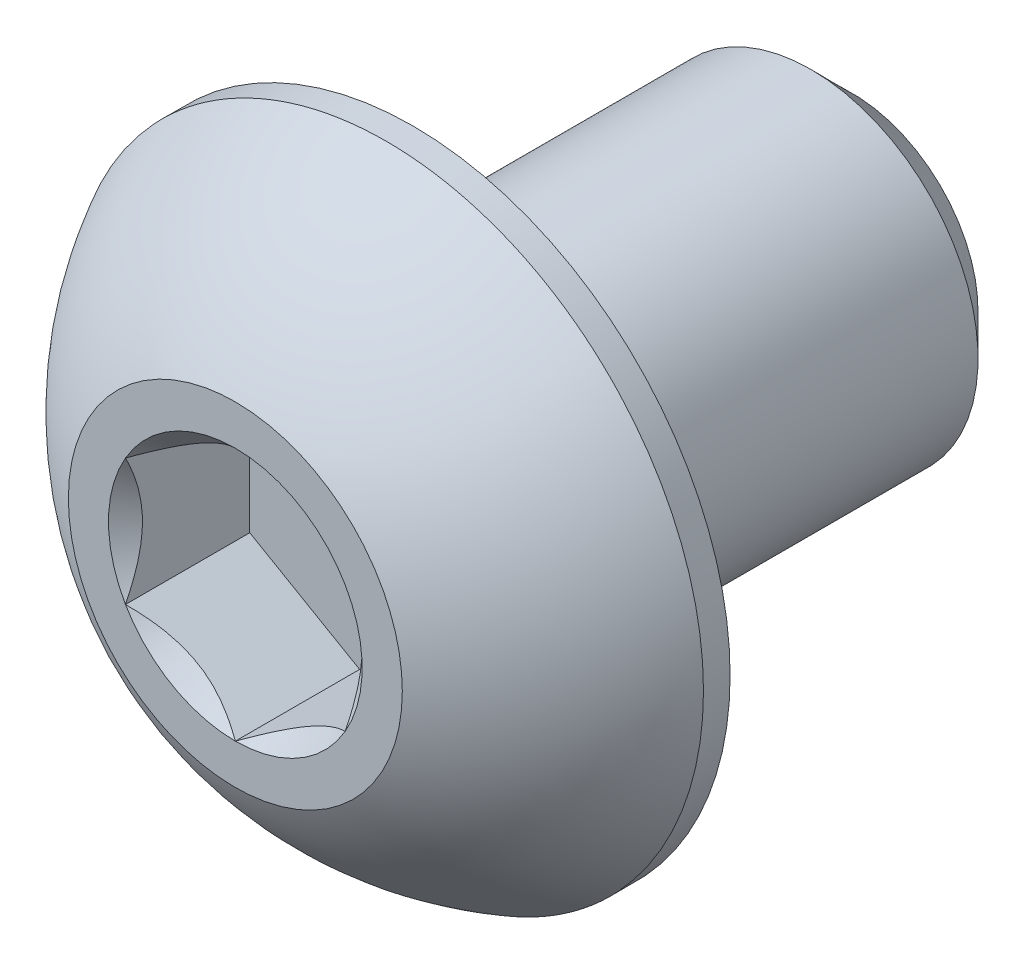
ISO-10303-21;
HEADER;
FILE_DESCRIPTION(('STEP AP214'),'2;1');
FILE_NAME('part.step','',(''),(''),'','','');
FILE_SCHEMA(('AUTOMOTIVE_DESIGN { 1 0 10303 214 1 1 1 1 }'));
ENDSEC;
DATA;
#1=APPLICATION_CONTEXT('core data for automotive mechanical design processes');
#2=APPLICATION_PROTOCOL_DEFINITION('international standard','automotive_design',2000,#1);
#3=PRODUCT_CONTEXT('',#1,'mechanical');
#4=PRODUCT('Part','Part','',(#3));
#5=PRODUCT_RELATED_PRODUCT_CATEGORY('part','',(#4));
#6=PRODUCT_DEFINITION_FORMATION('','',#4);
#7=PRODUCT_DEFINITION_CONTEXT('part definition',#1,'design');
#8=PRODUCT_DEFINITION('design','',#6,#7);
#9=PRODUCT_DEFINITION_SHAPE('','',#8);
#10=(LENGTH_UNIT() NAMED_UNIT(*) SI_UNIT(.MILLI.,.METRE.));
#11=(NAMED_UNIT(*) PLANE_ANGLE_UNIT() SI_UNIT($,.RADIAN.));
#12=(NAMED_UNIT(*) SI_UNIT($,.STERADIAN.) SOLID_ANGLE_UNIT());
#13=UNCERTAINTY_MEASURE_WITH_UNIT(LENGTH_MEASURE(1.E-05),#10,'distance_accuracy_value','');
#14=(GEOMETRIC_REPRESENTATION_CONTEXT(3) GLOBAL_UNCERTAINTY_ASSIGNED_CONTEXT((#13)) GLOBAL_UNIT_ASSIGNED_CONTEXT((#10,
#11,#12)) REPRESENTATION_CONTEXT('',''));
#15=CARTESIAN_POINT('',(0.,0.,0.));
#16=DIRECTION('',(0.,0.,1.));
#17=DIRECTION('',(1.,0.,0.));
#18=AXIS2_PLACEMENT_3D('',#15,#16,#17);
#19=CARTESIAN_POINT('',(1.5875,-0.91654355233853,-1.79578));
#20=DIRECTION('',(1.,0.,0.));
#21=DIRECTION('',(0.,0.,-1.));
#22=AXIS2_PLACEMENT_3D('',#19,#20,#21);
#23=PLANE('',#22);
#24=CARTESIAN_POINT('',(1.5875,0.916543552350696,-4.5148160186422E-11));
#25=CARTESIAN_POINT('',(1.5875,0.853951042749501,-0.0312670531094748));
#26=CARTESIAN_POINT('',(1.5875,0.790318655182352,-0.060708418532569));
#27=CARTESIAN_POINT('',(1.5875,0.660541633657406,-0.114675036009976));
#28=CARTESIAN_POINT('',(1.5875,0.594383506068261,-0.139167551527056));
#29=CARTESIAN_POINT('',(1.5875,0.460155167710008,-0.181460861757154));
#30=CARTESIAN_POINT('',(1.5875,0.392092287368855,-0.199284303379211));
#31=CARTESIAN_POINT('',(1.5875,0.254474472998349,-0.226724262258425));
#32=CARTESIAN_POINT('',(1.5875,0.18492484408494,-0.23636615820705));
#33=CARTESIAN_POINT('',(1.5875,0.0959348173027099,-0.242807117936028));
#34=CARTESIAN_POINT('',(1.5875,0.0767574755188689,-0.243848419588411));
#35=CARTESIAN_POINT('',(1.5875,0.0383876515905481,-0.245238539012701));
#36=CARTESIAN_POINT('',(1.5875,0.0191951833459475,-0.245587732962164));
#37=CARTESIAN_POINT('',(1.5875,-0.04817613738867,-0.245585527984756));
#38=CARTESIAN_POINT('',(1.5875,-0.0963693775085044,-0.243380381653055));
#39=CARTESIAN_POINT('',(1.5875,-0.19237997675968,-0.234690759054081));
#40=CARTESIAN_POINT('',(1.5875,-0.240197050167174,-0.22820329805671));
#41=CARTESIAN_POINT('',(1.5875,-0.383011002180377,-0.202723016482505));
#42=CARTESIAN_POINT('',(1.5875,-0.476967063071653,-0.177716619167796));
#43=CARTESIAN_POINT('',(1.5875,-0.628737189875188,-0.12655997132136));
#44=CARTESIAN_POINT('',(1.5875,-0.687787687831008,-0.103812337902688));
#45=CARTESIAN_POINT('',(1.5875,-0.803652764120619,-0.0545108768258671));
#46=CARTESIAN_POINT('',(1.5875,-0.860482853236759,-0.0279937656188529));
#47=CARTESIAN_POINT('',(1.5875,-0.916543552350696,-4.51483398026577E-11));
#48=B_SPLINE_CURVE_WITH_KNOTS('',3,(#24,#25,#26,#27,#28,#29,#30,#31,#32,#33,#34,#35,#36,#37,#38,
#39,#40,#41,#42,#43,#44,#45,#46,#47),.UNSPECIFIED.,.F.,.F.,(4,2,2,2,2,2,2,2,2,2,2,4),(0.,
0.210047204138572,0.421441388615704,0.632111059443719,0.842124830787818,0.89973295340684,
0.957309755998791,1.10181621379492,1.246423497634,1.53683268063418,1.72655304070107,
1.91453812064177),.UNSPECIFIED.);
#49=CARTESIAN_POINT('',(1.58750000000527,0.916543552341572,-4.51482158423473E-11));
#50=VERTEX_POINT('',#49);
#51=CARTESIAN_POINT('',(1.58750000000527,-0.916543552341572,-4.51486722899349E-11));
#52=VERTEX_POINT('',#51);
#53=EDGE_CURVE('E20',#50,#52,#48,.T.);
#54=ORIENTED_EDGE('',*,*,#53,.F.);
#55=DIRECTION('',(0.,0.,1.));
#56=VECTOR('',#55,1.);
#57=CARTESIAN_POINT('',(1.5875,0.916543552338531,-1.79578));
#58=LINE('',#57,#56);
#59=CARTESIAN_POINT('',(1.5875,0.916543552338531,-1.79578));
#60=VERTEX_POINT('',#59);
#61=EDGE_CURVE('E77',#50,#60,#58,.F.);
#62=ORIENTED_EDGE('',*,*,#61,.T.);
#63=DIRECTION('',(0.,1.,0.));
#64=VECTOR('',#63,1.);
#65=CARTESIAN_POINT('',(1.5875,-0.91654355233853,-1.79578));
#66=LINE('',#65,#64);
#67=CARTESIAN_POINT('',(1.5875,-0.91654355233853,-1.79578));
#68=VERTEX_POINT('',#67);
#69=EDGE_CURVE('E83',#68,#60,#66,.T.);
#70=ORIENTED_EDGE('',*,*,#69,.F.);
#71=DIRECTION('',(0.,0.,1.));
#72=VECTOR('',#71,1.);
#73=CARTESIAN_POINT('',(1.5875,-0.91654355233853,-1.79578));
#74=LINE('',#73,#72);
#75=EDGE_CURVE('E79',#68,#52,#74,.T.);
#76=ORIENTED_EDGE('',*,*,#75,.T.);
#77=EDGE_LOOP('',(#54,#62,#70,#76));
#78=FACE_BOUND('',#77,.T.);
#79=ADVANCED_FACE('F16',(#78),#23,.F.);
#80=CARTESIAN_POINT('',(1.5875,-0.91654355233853,-1.79578));
#81=DIRECTION('',(0.,0.,1.));
#82=DIRECTION('',(1.,0.,0.));
#83=AXIS2_PLACEMENT_3D('',#80,#81,#82);
#84=PLANE('',#83);
#85=DIRECTION('',(0.,-1.,0.));
#86=VECTOR('',#85,1.);
#87=CARTESIAN_POINT('',(-1.5875,0.916543552338531,-1.79578));
#88=LINE('',#87,#86);
#89=CARTESIAN_POINT('',(-1.5875,0.91654355233853,-1.79578));
#90=VERTEX_POINT('',#89);
#91=CARTESIAN_POINT('',(-1.5875,-0.916543552338531,-1.79578));
#92=VERTEX_POINT('',#91);
#93=EDGE_CURVE('E247',#90,#92,#88,.T.);
#94=ORIENTED_EDGE('',*,*,#93,.T.);
#95=DIRECTION('',(0.866025403784439,-0.5,0.));
#96=VECTOR('',#95,1.);
#97=CARTESIAN_POINT('',(-1.5875,-0.916543552338531,-1.79578));
#98=LINE('',#97,#96);
#99=CARTESIAN_POINT('',(0.,-1.83308710467706,-1.79578));
#100=VERTEX_POINT('',#99);
#101=EDGE_CURVE('E278',#92,#100,#98,.T.);
#102=ORIENTED_EDGE('',*,*,#101,.T.);
#103=DIRECTION('',(0.866025403784438,0.5,0.));
#104=VECTOR('',#103,1.);
#105=CARTESIAN_POINT('',(0.,-1.83308710467706,-1.79578));
#106=LINE('',#105,#104);
#107=EDGE_CURVE('E265',#100,#68,#106,.T.);
#108=ORIENTED_EDGE('',*,*,#107,.T.);
#109=ORIENTED_EDGE('',*,*,#69,.T.);
#110=DIRECTION('',(-0.866025403784439,0.5,0.));
#111=VECTOR('',#110,1.);
#112=CARTESIAN_POINT('',(1.5875,0.916543552338531,-1.79578));
#113=LINE('',#112,#111);
#114=CARTESIAN_POINT('',(0.,1.83308710467706,-1.79578));
#115=VERTEX_POINT('',#114);
#116=EDGE_CURVE('E93',#60,#115,#113,.T.);
#117=ORIENTED_EDGE('',*,*,#116,.T.);
#118=DIRECTION('',(-0.866025403784438,-0.5,0.));
#119=VECTOR('',#118,1.);
#120=CARTESIAN_POINT('',(0.,1.83308710467706,-1.79578));
#121=LINE('',#120,#119);
#122=EDGE_CURVE('E95',#115,#90,#121,.T.);
#123=ORIENTED_EDGE('',*,*,#122,.T.);
#124=EDGE_LOOP('',(#94,#102,#108,#109,#117,#123));
#125=FACE_BOUND('',#124,.T.);
#126=ADVANCED_FACE('F184',(#125),#84,.T.);
#127=CARTESIAN_POINT('',(-1.5875,-0.916543552338531,-1.79578));
#128=DIRECTION('',(-0.5,-0.866025403784439,0.));
#129=DIRECTION('',(0.866025403784439,-0.5,0.));
#130=AXIS2_PLACEMENT_3D('',#127,#128,#129);
#131=PLANE('',#130);
#132=CARTESIAN_POINT('',(-1.58750000000813,-0.916543552333836,-4.65365177804234E-11));
#133=CARTESIAN_POINT('',(-1.53293684973442,-0.948045601832198,-0.0314718176892667));
#134=CARTESIAN_POINT('',(-1.47746140241271,-0.980074366276803,-0.0610949372672066));
#135=CARTESIAN_POINT('',(-1.36434127230903,-1.04538430384293,-0.115333604591992));
#136=CARTESIAN_POINT('',(-1.30668583767504,-1.07867168454911,-0.139918983823398));
#137=CARTESIAN_POINT('',(-1.1904264819008,-1.14579405490118,-0.18203390392943));
#138=CARTESIAN_POINT('',(-1.13185215255292,-1.17961195971778,-0.199669270496182));
#139=CARTESIAN_POINT('',(-1.01341433779326,-1.2479920639515,-0.226839911359059));
#140=CARTESIAN_POINT('',(-0.95355446788638,-1.28255217595589,-0.236395459908957));
#141=CARTESIAN_POINT('',(-0.850383225835588,-1.34211812032654,-0.245017258142065));
#142=CARTESIAN_POINT('',(-0.807205047661772,-1.36704705311831,-0.24629317825213));
#143=CARTESIAN_POINT('',(-0.720919334101995,-1.41686413306927,-0.244140862172588));
#144=CARTESIAN_POINT('',(-0.677811828778317,-1.44175226287199,-0.240710977134276));
#145=CARTESIAN_POINT('',(-0.592014799905288,-1.4912872005875,-0.22934368581992));
#146=CARTESIAN_POINT('',(-0.54932567052745,-1.51593378092527,-0.2214023797855));
#147=CARTESIAN_POINT('',(-0.464663949078726,-1.56481324859374,-0.2014437231592));
#148=CARTESIAN_POINT('',(-0.422691672575671,-1.58904595373128,-0.189424623694276));
#149=CARTESIAN_POINT('',(-0.315224720340997,-1.65109202753296,-0.153756168099754));
#150=CARTESIAN_POINT('',(-0.25039544383198,-1.68852122777681,-0.127422292452885));
#151=CARTESIAN_POINT('',(-0.155071115632602,-1.74355675432304,-0.0829693854516809));
#152=CARTESIAN_POINT('',(-0.12365879001164,-1.76169266897618,-0.0673516407383855));
#153=CARTESIAN_POINT('',(-0.0614115175424615,-1.79763114849258,-0.0346905494690997));
#154=CARTESIAN_POINT('',(-0.0305763044110986,-1.81543386709449,-0.0176478812714443));
#155=CARTESIAN_POINT('',(8.13171000505997E-12,-1.83308710468176,-4.65365727835881E-11));
#156=B_SPLINE_CURVE_WITH_KNOTS('',3,(#132,#133,#134,#135,#136,#137,#138,#139,#140,#141,#142,
#143,#144,#145,#146,#147,#148,#149,#150,#151,#152,#153,#154,#155),.UNSPECIFIED.,.F.,.F.,(4,2,2,
2,2,2,2,2,2,2,2,4),(0.,0.211427927731364,0.424087197146833,0.633370156420732,0.842126401513702,
0.991537201097076,1.14100036551936,1.29059292577182,1.44024972414901,1.67781721416321,
1.79627069410093,1.91466809994021),.UNSPECIFIED.);
#157=CARTESIAN_POINT('',(-1.5875,-0.916543552337613,-5.16900107800149E-11));
#158=VERTEX_POINT('',#157);
#159=CARTESIAN_POINT('',(4.06570704929158E-12,-1.8330871046766,-5.16899866893727E-11));
#160=VERTEX_POINT('',#159);
#161=EDGE_CURVE('E186',#158,#160,#156,.T.);
#162=ORIENTED_EDGE('',*,*,#161,.T.);
#163=DIRECTION('',(0.,0.,1.));
#164=VECTOR('',#163,1.);
#165=CARTESIAN_POINT('',(0.,-1.83308710467706,-1.79578));
#166=LINE('',#165,#164);
#167=EDGE_CURVE('E257',#160,#100,#166,.F.);
#168=ORIENTED_EDGE('',*,*,#167,.T.);
#169=ORIENTED_EDGE('',*,*,#101,.F.);
#170=DIRECTION('',(0.,0.,1.));
#171=VECTOR('',#170,1.);
#172=CARTESIAN_POINT('',(-1.5875,-0.916543552338531,-1.79578));
#173=LINE('',#172,#171);
#174=EDGE_CURVE('E241',#92,#158,#173,.T.);
#175=ORIENTED_EDGE('',*,*,#174,.T.);
#176=EDGE_LOOP('',(#162,#168,#169,#175));
#177=FACE_BOUND('',#176,.T.);
#178=ADVANCED_FACE('F180',(#177),#131,.F.);
#179=CARTESIAN_POINT('',(0.,-1.83308710467706,-1.79578));
#180=DIRECTION('',(0.5,-0.866025403784438,0.));
#181=DIRECTION('',(0.866025403784438,0.5,0.));
#182=AXIS2_PLACEMENT_3D('',#179,#180,#181);
#183=PLANE('',#182);
#184=CARTESIAN_POINT('',(-8.13084748350422E-12,-1.83308710468176,-4.65361675164433E-11));
#185=CARTESIAN_POINT('',(0.0545631502655831,-1.80158505518339,-0.0314718176892672));
#186=CARTESIAN_POINT('',(0.110038597587296,-1.76955629073879,-0.0610949372672078));
#187=CARTESIAN_POINT('',(0.22315872769098,-1.70424635317266,-0.115333604591995));
#188=CARTESIAN_POINT('',(0.280814162324968,-1.67095897246648,-0.1399189838234));
#189=CARTESIAN_POINT('',(0.397073518099212,-1.60383660211441,-0.182033903929432));
#190=CARTESIAN_POINT('',(0.455647847447088,-1.57001869729781,-0.199669270496184));
#191=CARTESIAN_POINT('',(0.574085662206744,-1.50163859306409,-0.226839911359059));
#192=CARTESIAN_POINT('',(0.633945532113621,-1.4670784810597,-0.236395459908957));
#193=CARTESIAN_POINT('',(0.737116774164411,-1.40751253668905,-0.245017258142065));
#194=CARTESIAN_POINT('',(0.780294952338226,-1.38258360389728,-0.24629317825213));
#195=CARTESIAN_POINT('',(0.866580665898003,-1.33276652394632,-0.244140862172588));
#196=CARTESIAN_POINT('',(0.90968817122168,-1.30787839414361,-0.240710977134277));
#197=CARTESIAN_POINT('',(0.995485200094709,-1.25834345642809,-0.229343685819921));
#198=CARTESIAN_POINT('',(1.03817432947255,-1.23369687609033,-0.2214023797855));
#199=CARTESIAN_POINT('',(1.12283605092127,-1.18481740842185,-0.2014437231592));
#200=CARTESIAN_POINT('',(1.16480832742433,-1.16058470328431,-0.189424623694276));
#201=CARTESIAN_POINT('',(1.27227527965931,-1.09853862948245,-0.153756168099651));
#202=CARTESIAN_POINT('',(1.33710455616863,-1.06110942923843,-0.127422292452638));
#203=CARTESIAN_POINT('',(1.43242888436844,-1.00607390269195,-0.0829693854511779));
#204=CARTESIAN_POINT('',(1.46384120998954,-0.987937988038733,-0.0673516407377908));
#205=CARTESIAN_POINT('',(1.52608848245899,-0.951999508522174,-0.0346905494683118));
#206=CARTESIAN_POINT('',(1.55692369559049,-0.934196789920184,-0.0176478812705549));
#207=CARTESIAN_POINT('',(1.58750000000985,-0.916543552332841,-4.55419445064032E-11));
#208=B_SPLINE_CURVE_WITH_KNOTS('',3,(#184,#185,#186,#187,#188,#189,#190,#191,#192,#193,#194,
#195,#196,#197,#198,#199,#200,#201,#202,#203,#204,#205,#206,#207),.UNSPECIFIED.,.F.,.F.,(4,2,2,
2,2,2,2,2,2,2,2,4),(0.,0.211427927731369,0.424087197146844,0.633370156420738,0.842126401513702,
0.991537201097074,1.14100036551936,1.29059292577182,1.44024972414901,1.67781721416432,
1.7962706941026,1.91466809994243),.UNSPECIFIED.);
#209=EDGE_CURVE('E103',#160,#52,#208,.T.);
#210=ORIENTED_EDGE('',*,*,#209,.T.);
#211=ORIENTED_EDGE('',*,*,#75,.F.);
#212=ORIENTED_EDGE('',*,*,#107,.F.);
#213=ORIENTED_EDGE('',*,*,#167,.F.);
#214=EDGE_LOOP('',(#210,#211,#212,#213));
#215=FACE_BOUND('',#214,.T.);
#216=ADVANCED_FACE('F175',(#215),#183,.F.);
#217=CARTESIAN_POINT('',(1.5875,0.916543552338531,-1.79578));
#218=DIRECTION('',(0.5,0.866025403784439,0.));
#219=DIRECTION('',(-0.866025403784439,0.5,0.));
#220=AXIS2_PLACEMENT_3D('',#217,#218,#219);
#221=PLANE('',#220);
#222=CARTESIAN_POINT('',(1.58750000000388,0.916543552325157,-4.09205335444077E-11));
#223=CARTESIAN_POINT('',(1.53293684973449,0.948045601828149,-0.0314718176863875));
#224=CARTESIAN_POINT('',(1.47746140241465,0.980074366274606,-0.0610949372654595));
#225=CARTESIAN_POINT('',(1.3643412723126,1.04538430384195,-0.1153336045911));
#226=CARTESIAN_POINT('',(1.30668583767836,1.07867168454748,-0.139918983822225));
#227=CARTESIAN_POINT('',(1.19042648190426,1.1457940548989,-0.182033903928146));
#228=CARTESIAN_POINT('',(1.13185215255677,1.17961195971548,-0.199669270495064));
#229=CARTESIAN_POINT('',(1.01341433779771,1.247992063949,-0.226839911358272));
#230=CARTESIAN_POINT('',(0.953554467891033,1.28255217595322,-0.236395459908332));
#231=CARTESIAN_POINT('',(0.85038322584057,1.34211812032365,-0.245017258141818));
#232=CARTESIAN_POINT('',(0.807205047666872,1.36704705311536,-0.246293178252067));
#233=CARTESIAN_POINT('',(0.720919334107315,1.4168641330662,-0.24414086217291));
#234=CARTESIAN_POINT('',(0.677811828783741,1.44175226286886,-0.240710977134801));
#235=CARTESIAN_POINT('',(0.592014799910885,1.49128720058427,-0.229343685820857));
#236=CARTESIAN_POINT('',(0.549325670533118,1.51593378092199,-0.221402379786645));
#237=CARTESIAN_POINT('',(0.464663949084521,1.5648132485904,-0.201443723160757));
#238=CARTESIAN_POINT('',(0.422691672581523,1.58904595372791,-0.189424623696037));
#239=CARTESIAN_POINT('',(0.315224720345838,1.65109202753017,-0.153756168101648));
#240=CARTESIAN_POINT('',(0.250395443835785,1.68852122777462,-0.127422292454545));
#241=CARTESIAN_POINT('',(0.155071115634923,1.7435567543217,-0.0829693854528209));
#242=CARTESIAN_POINT('',(0.123658790013484,1.76169266897511,-0.0673516407393276));
#243=CARTESIAN_POINT('',(0.0614115175433705,1.79763114849205,-0.0346905494696016));
#244=CARTESIAN_POINT('',(0.0305763044115495,1.81543386709423,-0.0176478812717039));
#245=CARTESIAN_POINT('',(-8.13179444088293E-12,1.83308710468176,-4.65362862267458E-11));
#246=B_SPLINE_CURVE_WITH_KNOTS('',3,(#222,#223,#224,#225,#226,#227,#228,#229,#230,#231,#232,
#233,#234,#235,#236,#237,#238,#239,#240,#241,#242,#243,#244,#245),.UNSPECIFIED.,.F.,.F.,(4,2,2,
2,2,2,2,2,2,2,2,4),(0.,0.211427927730897,0.424087197145704,0.633370156418781,0.842126401511014,
0.991537201094014,1.1410003655159,1.29059292576802,1.44024972414487,1.67781721416266,
1.79627069410213,1.91466809994315),.UNSPECIFIED.);
#247=CARTESIAN_POINT('',(-4.06599721055526E-12,1.8330871046766,-5.16897760556717E-11));
#248=VERTEX_POINT('',#247);
#249=EDGE_CURVE('E90',#50,#248,#246,.T.);
#250=ORIENTED_EDGE('',*,*,#249,.T.);
#251=DIRECTION('',(0.,0.,1.));
#252=VECTOR('',#251,1.);
#253=CARTESIAN_POINT('',(0.,1.83308710467706,-1.79578));
#254=LINE('',#253,#252);
#255=EDGE_CURVE('E250',#248,#115,#254,.F.);
#256=ORIENTED_EDGE('',*,*,#255,.T.);
#257=ORIENTED_EDGE('',*,*,#116,.F.);
#258=ORIENTED_EDGE('',*,*,#61,.F.);
#259=EDGE_LOOP('',(#250,#256,#257,#258));
#260=FACE_BOUND('',#259,.T.);
#261=ADVANCED_FACE('F88',(#260),#221,.F.);
#262=CARTESIAN_POINT('',(0.,1.83308710467706,-1.79578));
#263=DIRECTION('',(-0.5,0.866025403784438,0.));
#264=DIRECTION('',(-0.866025403784438,-0.5,0.));
#265=AXIS2_PLACEMENT_3D('',#262,#263,#264);
#266=PLANE('',#265);
#267=CARTESIAN_POINT('',(8.13097600560689E-12,1.83308710468176,-4.65363184454702E-11));
#268=CARTESIAN_POINT('',(-0.0545631502655817,1.80158505518339,-0.0314718176892664));
#269=CARTESIAN_POINT('',(-0.110038597587293,1.76955629073879,-0.0610949372672064));
#270=CARTESIAN_POINT('',(-0.223158727690974,1.70424635317266,-0.115333604591992));
#271=CARTESIAN_POINT('',(-0.280814162324961,1.67095897246649,-0.139918983823398));
#272=CARTESIAN_POINT('',(-0.397073518099204,1.60383660211441,-0.18203390392943));
#273=CARTESIAN_POINT('',(-0.455647847447081,1.57001869729782,-0.199669270496182));
#274=CARTESIAN_POINT('',(-0.574085662206741,1.50163859306409,-0.226839911359059));
#275=CARTESIAN_POINT('',(-0.63394553211362,1.4670784810597,-0.236395459908958));
#276=CARTESIAN_POINT('',(-0.737116774164412,1.40751253668905,-0.245017258142065));
#277=CARTESIAN_POINT('',(-0.780294952338228,1.38258360389728,-0.24629317825213));
#278=CARTESIAN_POINT('',(-0.866580665898006,1.33276652394632,-0.244140862172588));
#279=CARTESIAN_POINT('',(-0.909688171221683,1.3078783941436,-0.240710977134277));
#280=CARTESIAN_POINT('',(-0.995485200094712,1.25834345642809,-0.22934368581992));
#281=CARTESIAN_POINT('',(-1.03817432947255,1.23369687609032,-0.2214023797855));
#282=CARTESIAN_POINT('',(-1.12283605092127,1.18481740842185,-0.2014437231592));
#283=CARTESIAN_POINT('',(-1.16480832742433,1.16058470328431,-0.189424623694275));
#284=CARTESIAN_POINT('',(-1.272275279659,1.09853862948263,-0.153756168099754));
#285=CARTESIAN_POINT('',(-1.33710455616802,1.06110942923878,-0.127422292452885));
#286=CARTESIAN_POINT('',(-1.4324288843674,1.00607390269255,-0.082969385451681));
#287=CARTESIAN_POINT('',(-1.46384120998836,0.987937988039414,-0.0673516407383855));
#288=CARTESIAN_POINT('',(-1.52608848245754,0.951999508523014,-0.0346905494690997));
#289=CARTESIAN_POINT('',(-1.5569236955889,0.934196789921102,-0.0176478812714444));
#290=CARTESIAN_POINT('',(-1.58750000000813,0.916543552333835,-4.653668523112E-11));
#291=B_SPLINE_CURVE_WITH_KNOTS('',3,(#267,#268,#269,#270,#271,#272,#273,#274,#275,#276,#277,
#278,#279,#280,#281,#282,#283,#284,#285,#286,#287,#288,#289,#290),.UNSPECIFIED.,.F.,.F.,(4,2,2,
2,2,2,2,2,2,2,2,4),(0.,0.211427927731364,0.424087197146833,0.633370156420733,0.842126401513703,
0.991537201097077,1.14100036551936,1.29059292577183,1.44024972414901,1.67781721416321,
1.79627069410093,1.91466809994021),.UNSPECIFIED.);
#292=CARTESIAN_POINT('',(-1.58750000000164,0.91654355233478,-5.16901581880083E-11));
#293=VERTEX_POINT('',#292);
#294=EDGE_CURVE('E102',#248,#293,#291,.T.);
#295=ORIENTED_EDGE('',*,*,#294,.T.);
#296=DIRECTION('',(0.,0.,1.));
#297=VECTOR('',#296,1.);
#298=CARTESIAN_POINT('',(-1.5875,0.916543552338531,-1.79578));
#299=LINE('',#298,#297);
#300=EDGE_CURVE('E44',#293,#90,#299,.F.);
#301=ORIENTED_EDGE('',*,*,#300,.T.);
#302=ORIENTED_EDGE('',*,*,#122,.F.);
#303=ORIENTED_EDGE('',*,*,#255,.F.);
#304=EDGE_LOOP('',(#295,#301,#302,#303));
#305=FACE_BOUND('',#304,.T.);
#306=ADVANCED_FACE('F174',(#305),#266,.F.);
#307=CARTESIAN_POINT('',(-1.5875,0.916543552338531,-1.79578));
#308=DIRECTION('',(-1.,0.,0.));
#309=DIRECTION('',(0.,-1.,0.));
#310=AXIS2_PLACEMENT_3D('',#307,#308,#309);
#311=PLANE('',#310);
#312=CARTESIAN_POINT('',(-1.5875,0.91654355234792,-4.65366352460325E-11));
#313=CARTESIAN_POINT('',(-1.5875,0.853539453351184,-0.0314718176892657));
#314=CARTESIAN_POINT('',(-1.5875,0.789481924461962,-0.0610949372672041));
#315=CARTESIAN_POINT('',(-1.5875,0.658862049329687,-0.115333604591986));
#316=CARTESIAN_POINT('',(-1.5875,0.59228728791732,-0.139918983823388));
#317=CARTESIAN_POINT('',(-1.5875,0.458042547213152,-0.182033903929413));
#318=CARTESIAN_POINT('',(-1.5875,0.390406737579943,-0.199669270496161));
#319=CARTESIAN_POINT('',(-1.5875,0.25364652911248,-0.226839911359028));
#320=CARTESIAN_POINT('',(-1.5875,0.184526305103684,-0.23639545990892));
#321=CARTESIAN_POINT('',(-1.5875,0.065394416362353,-0.245017258142017));
#322=CARTESIAN_POINT('',(-1.5875,0.0155365507787979,-0.246293178252077));
#323=CARTESIAN_POINT('',(-1.5875,-0.0840976091231442,-0.244140862172523));
#324=CARTESIAN_POINT('',(-1.5875,-0.133873868728595,-0.240710977134206));
#325=CARTESIAN_POINT('',(-1.5875,-0.23294374415965,-0.229343685819835));
#326=CARTESIAN_POINT('',(-1.5875,-0.282236904835194,-0.221402379785407));
#327=CARTESIAN_POINT('',(-1.5875,-0.379995840172177,-0.20144372315909));
#328=CARTESIAN_POINT('',(-1.5875,-0.42846125044727,-0.189424623694157));
#329=CARTESIAN_POINT('',(-1.5875,-0.552553398050583,-0.153756168099635));
#330=CARTESIAN_POINT('',(-1.5875,-0.627411798538228,-0.127422292452783));
#331=CARTESIAN_POINT('',(-1.5875,-0.737482851630614,-0.0829693854516115));
#332=CARTESIAN_POINT('',(-1.5875,-0.773754680936859,-0.0673516407383284));
#333=CARTESIAN_POINT('',(-1.5875,-0.84563163996961,-0.0346905494690696));
#334=CARTESIAN_POINT('',(-1.5875,-0.88123707717341,-0.017647881271429));
#335=CARTESIAN_POINT('',(-1.5875,-0.91654355234792,-4.65367892631301E-11));
#336=B_SPLINE_CURVE_WITH_KNOTS('',3,(#312,#313,#314,#315,#316,#317,#318,#319,#320,#321,#322,
#323,#324,#325,#326,#327,#328,#329,#330,#331,#332,#333,#334,#335),.UNSPECIFIED.,.F.,.F.,(4,2,2,
2,2,2,2,2,2,2,2,4),(0.,0.211427927731395,0.424087197146895,0.633370156420825,0.842126401513824,
0.991537201097242,1.14100036551957,1.29059292577208,1.44024972414931,1.67781721416334,
1.79627069410098,1.91466809994017),.UNSPECIFIED.);
#337=EDGE_CURVE('E127',#293,#158,#336,.T.);
#338=ORIENTED_EDGE('',*,*,#337,.T.);
#339=ORIENTED_EDGE('',*,*,#174,.F.);
#340=ORIENTED_EDGE('',*,*,#93,.F.);
#341=ORIENTED_EDGE('',*,*,#300,.F.);
#342=EDGE_LOOP('',(#338,#339,#340,#341));
#343=FACE_BOUND('',#342,.T.);
#344=ADVANCED_FACE('F142',(#343),#311,.F.);
#345=CARTESIAN_POINT('',(0.,0.,-5.6843418860808E-11));
#346=DIRECTION('',(0.,0.,1.));
#347=DIRECTION('',(1.,0.,0.));
#348=AXIS2_PLACEMENT_3D('',#345,#346,#347);
#349=CONICAL_SURFACE('',#348,1.83308710467145,0.78539816351237);
#350=ORIENTED_EDGE('',*,*,#161,.F.);
#351=CARTESIAN_POINT('',(0.,0.,-5.6843418860808E-11));
#352=DIRECTION('',(0.,0.,1.));
#353=DIRECTION('',(1.,0.,0.));
#354=AXIS2_PLACEMENT_3D('',#351,#352,#353);
#355=CIRCLE('',#354,1.83308710467145);
#356=EDGE_CURVE('E120',#158,#160,#355,.T.);
#357=ORIENTED_EDGE('',*,*,#356,.T.);
#358=EDGE_LOOP('',(#350,#357));
#359=FACE_BOUND('',#358,.T.);
#360=ADVANCED_FACE('F193',(#359),#349,.F.);
#361=CARTESIAN_POINT('',(0.,0.,-5.6843418860808E-11));
#362=DIRECTION('',(0.,0.,1.));
#363=DIRECTION('',(1.,0.,0.));
#364=AXIS2_PLACEMENT_3D('',#361,#362,#363);
#365=CONICAL_SURFACE('',#364,1.83308710467145,0.78539816351237);
#366=ORIENTED_EDGE('',*,*,#209,.F.);
#367=CARTESIAN_POINT('',(0.,0.,-5.6843418860808E-11));
#368=DIRECTION('',(0.,0.,1.));
#369=DIRECTION('',(1.,0.,0.));
#370=AXIS2_PLACEMENT_3D('',#367,#368,#369);
#371=CIRCLE('',#370,1.83308710467145);
#372=EDGE_CURVE('E113',#160,#52,#371,.T.);
#373=ORIENTED_EDGE('',*,*,#372,.T.);
#374=EDGE_LOOP('',(#366,#373));
#375=FACE_BOUND('',#374,.T.);
#376=ADVANCED_FACE('F196',(#375),#365,.F.);
#377=CARTESIAN_POINT('',(0.,0.,-5.6843418860808E-11));
#378=DIRECTION('',(0.,0.,1.));
#379=DIRECTION('',(1.,0.,0.));
#380=AXIS2_PLACEMENT_3D('',#377,#378,#379);
#381=CONICAL_SURFACE('',#380,1.83308710467145,0.785398163397448);
#382=CARTESIAN_POINT('',(0.,0.,-5.6843418860808E-11));
#383=DIRECTION('',(0.,0.,1.));
#384=DIRECTION('',(1.,0.,0.));
#385=AXIS2_PLACEMENT_3D('',#382,#383,#384);
#386=CIRCLE('',#385,1.83308710467145);
#387=EDGE_CURVE('E67',#52,#50,#386,.T.);
#388=ORIENTED_EDGE('',*,*,#387,.T.);
#389=ORIENTED_EDGE('',*,*,#53,.T.);
#390=EDGE_LOOP('',(#388,#389));
#391=FACE_BOUND('',#390,.T.);
#392=ADVANCED_FACE('F111',(#391),#381,.F.);
#393=CARTESIAN_POINT('',(0.,0.,-5.6843418860808E-11));
#394=DIRECTION('',(0.,0.,1.));
#395=DIRECTION('',(1.,0.,0.));
#396=AXIS2_PLACEMENT_3D('',#393,#394,#395);
#397=CONICAL_SURFACE('',#396,1.83308710467145,0.78539816351237);
#398=ORIENTED_EDGE('',*,*,#249,.F.);
#399=CARTESIAN_POINT('',(0.,0.,-5.6843418860808E-11));
#400=DIRECTION('',(0.,0.,1.));
#401=DIRECTION('',(1.,0.,0.));
#402=AXIS2_PLACEMENT_3D('',#399,#400,#401);
#403=CIRCLE('',#402,1.83308710467145);
#404=EDGE_CURVE('E100',#50,#248,#403,.T.);
#405=ORIENTED_EDGE('',*,*,#404,.T.);
#406=EDGE_LOOP('',(#398,#405));
#407=FACE_BOUND('',#406,.T.);
#408=ADVANCED_FACE('F99',(#407),#397,.F.);
#409=CARTESIAN_POINT('',(0.,0.,-5.6843418860808E-11));
#410=DIRECTION('',(0.,0.,1.));
#411=DIRECTION('',(1.,0.,0.));
#412=AXIS2_PLACEMENT_3D('',#409,#410,#411);
#413=CONICAL_SURFACE('',#412,1.83308710467145,0.78539816351237);
#414=ORIENTED_EDGE('',*,*,#294,.F.);
#415=CARTESIAN_POINT('',(0.,0.,-5.68432020203736E-11));
#416=DIRECTION('',(0.,0.,1.));
#417=DIRECTION('',(1.,0.,0.));
#418=AXIS2_PLACEMENT_3D('',#415,#416,#417);
#419=CIRCLE('',#418,1.83308710467145);
#420=EDGE_CURVE('E108',#248,#293,#419,.T.);
#421=ORIENTED_EDGE('',*,*,#420,.T.);
#422=EDGE_LOOP('',(#414,#421));
#423=FACE_BOUND('',#422,.T.);
#424=ADVANCED_FACE('F150',(#423),#413,.F.);
#425=CARTESIAN_POINT('',(0.,0.,-5.6843418860808E-11));
#426=DIRECTION('',(0.,0.,1.));
#427=DIRECTION('',(1.,0.,0.));
#428=AXIS2_PLACEMENT_3D('',#425,#426,#427);
#429=CONICAL_SURFACE('',#428,1.83308710467145,0.785398163512482);
#430=ORIENTED_EDGE('',*,*,#337,.F.);
#431=CARTESIAN_POINT('',(0.,0.,-5.6843418860808E-11));
#432=DIRECTION('',(0.,0.,1.));
#433=DIRECTION('',(1.,0.,0.));
#434=AXIS2_PLACEMENT_3D('',#431,#432,#433);
#435=CIRCLE('',#434,1.83308710467145);
#436=EDGE_CURVE('E330',#293,#158,#435,.T.);
#437=ORIENTED_EDGE('',*,*,#436,.T.);
#438=EDGE_LOOP('',(#430,#437));
#439=FACE_BOUND('',#438,.T.);
#440=ADVANCED_FACE('F145',(#439),#429,.F.);
#441=CARTESIAN_POINT('',(0.,-2.41300000000001,-8.9154));
#442=DIRECTION('',(0.,0.,-1.));
#443=DIRECTION('',(0.,1.,0.));
#444=AXIS2_PLACEMENT_3D('',#441,#442,#443);
#445=PLANE('',#444);
#446=CARTESIAN_POINT('',(0.,0.,-8.91539999997804));
#447=DIRECTION('',(0.,0.,1.));
#448=DIRECTION('',(0.,-1.,0.));
#449=AXIS2_PLACEMENT_3D('',#446,#447,#448);
#450=CIRCLE('',#449,1.8176875000222);
#451=CARTESIAN_POINT('',(0.,-1.8176875000222,-8.91539999997804));
#452=VERTEX_POINT('',#451);
#453=EDGE_CURVE('E309',#452,#452,#450,.T.);
#454=ORIENTED_EDGE('',*,*,#453,.F.);
#455=EDGE_LOOP('',(#454));
#456=FACE_BOUND('',#455,.T.);
#457=ADVANCED_FACE('F149',(#456),#445,.T.);
#458=CARTESIAN_POINT('',(0.,-2.413,0.));
#459=DIRECTION('',(0.,0.,-1.));
#460=DIRECTION('',(-1.,0.,0.));
#461=AXIS2_PLACEMENT_3D('',#458,#459,#460);
#462=PLANE('',#461);
#463=CARTESIAN_POINT('',(0.,2.41300000000001,0.));
#464=CARTESIAN_POINT('',(0.0677494728281043,2.41299959399955,0.));
#465=CARTESIAN_POINT('',(0.13551139645195,2.41014415989588,0.));
#466=CARTESIAN_POINT('',(0.270566967352935,2.39874098782787,0.));
#467=CARTESIAN_POINT('',(0.337860470451762,2.39019156931712,-1.27847024027233E-13));
#468=CARTESIAN_POINT('',(0.471601320639727,2.36743889257111,1.28918507901389E-13));
#469=CARTESIAN_POINT('',(0.538047150928301,2.35322665951012,4.80959012476224E-13));
#470=CARTESIAN_POINT('',(0.669542290683469,2.31924632100677,-4.80482413021759E-13));
#471=CARTESIAN_POINT('',(0.734590420561955,2.29947370693801,-1.79531897556432E-12));
#472=CARTESIAN_POINT('',(0.926662950450337,2.23208866037698,-3.22584967757263E-12));
#473=CARTESIAN_POINT('',(1.05093873255639,2.17635367452114,-8.45786465533834E-13));
#474=CARTESIAN_POINT('',(1.28835543096987,2.04478110377478,8.46685999083916E-13));
#475=CARTESIAN_POINT('',(1.40149592376953,1.96894275469913,1.58978621376691E-13));
#476=CARTESIAN_POINT('',(1.56039704916752,1.84183425468125,0.));
#477=CARTESIAN_POINT('',(1.61159242186082,1.79720603297069,0.));
#478=CARTESIAN_POINT('',(1.71000632967643,1.70383063464741,0.));
#479=CARTESIAN_POINT('',(1.75722865147863,1.65508747081338,0.));
#480=CARTESIAN_POINT('',(1.84741983372678,1.55377296533884,0.));
#481=CARTESIAN_POINT('',(1.89038675770033,1.50119989956805,0.));
#482=CARTESIAN_POINT('',(1.97174331906875,1.3926258162236,0.));
#483=CARTESIAN_POINT('',(2.01013189400735,1.33662400751775,0.));
#484=CARTESIAN_POINT('',(2.11797602264298,1.16408610688379,0.));
#485=CARTESIAN_POINT('',(2.18020511880695,1.04291047052782,0.));
#486=CARTESIAN_POINT('',(2.28339851019844,0.791897051410366,0.));
#487=CARTESIAN_POINT('',(2.32436303254154,0.66205936118038,0.));
#488=CARTESIAN_POINT('',(2.38392374490441,0.397332738666662,0.));
#489=CARTESIAN_POINT('',(2.40251981546714,0.262443779410977,0.));
#490=CARTESIAN_POINT('',(2.41679648401006,-0.00854142496427087,0.));
#491=CARTESIAN_POINT('',(2.41247708199024,-0.144637670083833,0.));
#492=CARTESIAN_POINT('',(2.38106276220064,-0.414157249403837,0.));
#493=CARTESIAN_POINT('',(2.35396796606072,-0.547580597874736,0.));
#494=CARTESIAN_POINT('',(2.27772157192305,-0.808047678299337,0.));
#495=CARTESIAN_POINT('',(2.22856973834409,-0.935091342098402,0.));
#496=CARTESIAN_POINT('',(2.13945238372271,-1.11800602259631,0.));
#497=CARTESIAN_POINT('',(2.10716082445999,-1.17773156541116,0.));
#498=CARTESIAN_POINT('',(2.03766328061094,-1.29425329321649,0.));
#499=CARTESIAN_POINT('',(2.00045843572899,-1.35105015331986,0.));
#500=CARTESIAN_POINT('',(1.92141236423528,-1.46128080675297,0.));
#501=CARTESIAN_POINT('',(1.87957324454218,-1.51471611118972,0.));
#502=CARTESIAN_POINT('',(1.79151575044596,-1.61791562667817,0.));
#503=CARTESIAN_POINT('',(1.74529318867507,-1.66767624505837,0.));
#504=CARTESIAN_POINT('',(1.60062790056994,-1.81077793214477,0.));
#505=CARTESIAN_POINT('',(1.496082606595,-1.89808490671825,0.));
#506=CARTESIAN_POINT('',(1.27380547141758,-2.05387612994836,0.));
#507=CARTESIAN_POINT('',(1.15607413167662,-2.12236109405874,0.));
#508=CARTESIAN_POINT('',(0.972145513690423,-2.20955550169802,0.));
#509=CARTESIAN_POINT('',(0.909535130507399,-2.23605371645848,0.));
#510=CARTESIAN_POINT('',(0.782338486500698,-2.28366305312172,0.));
#511=CARTESIAN_POINT('',(0.717753872487818,-2.30477853474402,0.));
#512=CARTESIAN_POINT('',(0.587144181474127,-2.34145833738057,0.));
#513=CARTESIAN_POINT('',(0.521121555924461,-2.35703142415597,0.));
#514=CARTESIAN_POINT('',(0.38801185086693,-2.38256269878371,0.));
#515=CARTESIAN_POINT('',(0.320925091325935,-2.39252254272931,0.));
#516=CARTESIAN_POINT('',(0.211445294063883,-2.40409104943932,0.));
#517=CARTESIAN_POINT('',(0.16922754124227,-2.40743084866624,0.));
#518=CARTESIAN_POINT('',(0.0846748132034888,-2.41188545081099,0.));
#519=CARTESIAN_POINT('',(0.0423398379863207,-2.41300025372882,0.));
#520=CARTESIAN_POINT('',(-0.0677494728281031,-2.41299959399954,0.));
#521=CARTESIAN_POINT('',(-0.135511396451949,-2.41014415989587,0.));
#522=CARTESIAN_POINT('',(-0.270566967352934,-2.39874098782787,0.));
#523=CARTESIAN_POINT('',(-0.337860470451761,-2.39019156931711,-1.27836024207223E-13));
#524=CARTESIAN_POINT('',(-0.471601320639725,-2.36743889257111,1.28907490578305E-13));
#525=CARTESIAN_POINT('',(-0.538047150928299,-2.35322665951012,4.8098540959153E-13));
#526=CARTESIAN_POINT('',(-0.669542290683467,-2.31924632100677,-4.80508831603149E-13));
#527=CARTESIAN_POINT('',(-0.734590420561954,-2.29947370693801,-1.79543572810586E-12));
#528=CARTESIAN_POINT('',(-0.926662950450336,-2.23208866037698,-3.22561672903511E-12));
#529=CARTESIAN_POINT('',(-1.05093873255638,-2.17635367452113,-8.44496166373919E-13));
#530=CARTESIAN_POINT('',(-1.28835543096987,-2.04478110377478,8.45395650869079E-13));
#531=CARTESIAN_POINT('',(-1.40149592376953,-1.96894275469912,1.54050096654222E-13));
#532=CARTESIAN_POINT('',(-1.56039704916752,-1.84183425468125,0.));
#533=CARTESIAN_POINT('',(-1.61159242186081,-1.79720603297069,0.));
#534=CARTESIAN_POINT('',(-1.71000632967643,-1.70383063464741,0.));
#535=CARTESIAN_POINT('',(-1.75722865147862,-1.65508747081338,0.));
#536=CARTESIAN_POINT('',(-1.84741983372678,-1.55377296533883,0.));
#537=CARTESIAN_POINT('',(-1.89038675770033,-1.50119989956804,0.));
#538=CARTESIAN_POINT('',(-1.97174331906875,-1.3926258162236,0.));
#539=CARTESIAN_POINT('',(-2.01013189400735,-1.33662400751774,0.));
#540=CARTESIAN_POINT('',(-2.11797602264298,-1.16408610688378,0.));
#541=CARTESIAN_POINT('',(-2.18020511880695,-1.04291047052781,0.));
#542=CARTESIAN_POINT('',(-2.28339851019844,-0.791897051410362,0.));
#543=CARTESIAN_POINT('',(-2.32436303254155,-0.662059361180377,0.));
#544=CARTESIAN_POINT('',(-2.38392374490441,-0.39733273866666,0.));
#545=CARTESIAN_POINT('',(-2.40251981546714,-0.262443779410975,0.));
#546=CARTESIAN_POINT('',(-2.41679648401005,0.00854142496427396,0.));
#547=CARTESIAN_POINT('',(-2.41247708199024,0.144637670083837,0.));
#548=CARTESIAN_POINT('',(-2.38106276220064,0.414157249403841,0.));
#549=CARTESIAN_POINT('',(-2.35396796606071,0.547580597874739,0.));
#550=CARTESIAN_POINT('',(-2.27772157192305,0.808047678299341,0.));
#551=CARTESIAN_POINT('',(-2.22856973834409,0.935091342098406,0.));
#552=CARTESIAN_POINT('',(-2.13945238372271,1.11800602259631,0.));
#553=CARTESIAN_POINT('',(-2.10716082445999,1.17773156541116,0.));
#554=CARTESIAN_POINT('',(-2.03766328061094,1.29425329321649,0.));
#555=CARTESIAN_POINT('',(-2.00045843572899,1.35105015331986,0.));
#556=CARTESIAN_POINT('',(-1.92141236423528,1.46128080675297,0.));
#557=CARTESIAN_POINT('',(-1.87957324454219,1.51471611118972,0.));
#558=CARTESIAN_POINT('',(-1.79151575044596,1.61791562667817,0.));
#559=CARTESIAN_POINT('',(-1.74529318867507,1.66767624505838,0.));
#560=CARTESIAN_POINT('',(-1.60062790056994,1.81077793214478,0.));
#561=CARTESIAN_POINT('',(-1.496082606595,1.89808490671826,0.));
#562=CARTESIAN_POINT('',(-1.27380547141758,2.05387612994837,0.));
#563=CARTESIAN_POINT('',(-1.15607413167662,2.12236109405875,0.));
#564=CARTESIAN_POINT('',(-0.972145513690428,2.20955550169803,0.));
#565=CARTESIAN_POINT('',(-0.909535130507403,2.23605371645849,0.));
#566=CARTESIAN_POINT('',(-0.782338486500701,2.28366305312172,0.));
#567=CARTESIAN_POINT('',(-0.717753872487821,2.30477853474403,0.));
#568=CARTESIAN_POINT('',(-0.58714418147413,2.34145833738058,0.));
#569=CARTESIAN_POINT('',(-0.521121555924464,2.35703142415597,0.));
#570=CARTESIAN_POINT('',(-0.388011850866933,2.38256269878371,0.));
#571=CARTESIAN_POINT('',(-0.320925091325938,2.39252254272931,0.));
#572=CARTESIAN_POINT('',(-0.211445294063886,2.40409104943933,0.));
#573=CARTESIAN_POINT('',(-0.169227541242272,2.40743084866625,0.));
#574=CARTESIAN_POINT('',(-0.084674813203489,2.411885450811,0.));
#575=CARTESIAN_POINT('',(-0.0423398379863203,2.41300025372883,0.));
#576=CARTESIAN_POINT('',(0.,2.41300000000001,0.));
#577=B_SPLINE_CURVE_WITH_KNOTS('',3,(#463,#464,#465,#466,#467,#468,#469,#470,#471,#472,#473,
#474,#475,#476,#477,#478,#479,#480,#481,#482,#483,#484,#485,#486,#487,#488,#489,#490,#491,#492,
#493,#494,#495,#496,#497,#498,#499,#500,#501,#502,#503,#504,#505,#506,#507,#508,#509,#510,#511,
#512,#513,#514,#515,#516,#517,#518,#519,#520,#521,#522,#523,#524,#525,#526,#527,#528,#529,#530,
#531,#532,#533,#534,#535,#536,#537,#538,#539,#540,#541,#542,#543,#544,#545,#546,#547,#548,#549,
#550,#551,#552,#553,#554,#555,#556,#557,#558,#559,#560,#561,#562,#563,#564,#565,#566,#567,#568,
#569,#570,#571,#572,#573,#574,#575,#576),.UNSPECIFIED.,.T.,.F.,(4,2,2,2,2,2,2,2,2,2,2,2,2,2,2,2,
2,2,2,2,2,2,2,2,2,2,2,2,2,2,2,2,2,2,2,2,2,2,2,2,2,2,2,2,2,2,2,2,2,2,2,2,2,2,2,2,4),(0.,
0.203209440650574,0.406478883981518,0.610071772627359,0.81383022262209,1.22037583015362,
1.62693689383914,1.83048379912032,2.0338344545274,2.23727722607604,2.44076711727222,
2.84732262402718,3.25387378849006,3.66042712409903,4.06698045970797,4.47353162417079,
4.88008713092581,5.08357702212203,5.28701979367075,5.49037044907782,5.69391735435889,
6.1004784180441,6.50702402557576,6.71078247557089,6.914375364217,7.11764480754802,
7.32085424819875,7.44784940307259,7.57484455794647,7.77805399859704,7.98132344192799,
8.18491633057383,8.38867478056856,8.79522038810009,9.20178145178561,9.40532835706679,
9.60867901247387,9.81212178402251,10.0156116752187,10.4221671819737,10.8287183464365,
11.2352716820455,11.6418250176544,12.0483761821173,12.4549316888723,12.6584215800685,
12.8618643516172,13.0652150070243,13.2687619123054,13.6753229759906,14.0818685835222,
14.2856270335174,14.4892199221635,14.6924893654945,14.8956988061452,15.0226939610191,
15.1496891158929),.UNSPECIFIED.);
#578=CARTESIAN_POINT('',(0.,2.41300000000001,0.));
#579=VERTEX_POINT('',#578);
#580=EDGE_CURVE('E238',#579,#579,#577,.T.);
#581=ORIENTED_EDGE('',*,*,#580,.F.);
#582=EDGE_LOOP('',(#581));
#583=FACE_BOUND('',#582,.T.);
#584=ORIENTED_EDGE('',*,*,#420,.F.);
#585=ORIENTED_EDGE('',*,*,#404,.F.);
#586=ORIENTED_EDGE('',*,*,#387,.F.);
#587=ORIENTED_EDGE('',*,*,#372,.F.);
#588=ORIENTED_EDGE('',*,*,#356,.F.);
#589=ORIENTED_EDGE('',*,*,#436,.F.);
#590=EDGE_LOOP('',(#584,#585,#586,#587,#588,#589));
#591=FACE_BOUND('',#590,.T.);
#592=ADVANCED_FACE('F105',(#583,#591),#462,.F.);
#593=CARTESIAN_POINT('',(0.,0.,-8.32008750006707));
#594=DIRECTION('',(0.,0.,1.));
#595=DIRECTION('',(0.,-1.,0.));
#596=AXIS2_PLACEMENT_3D('',#593,#594,#595);
#597=CONICAL_SURFACE('',#596,2.41299999993316,0.785398163397448);
#598=CARTESIAN_POINT('',(0.,0.,-8.3200875));
#599=DIRECTION('',(0.,0.,-1.));
#600=DIRECTION('',(0.,1.,0.));
#601=AXIS2_PLACEMENT_3D('',#598,#599,#600);
#602=CIRCLE('',#601,2.41300000000001);
#603=CARTESIAN_POINT('',(0.,2.413,-8.3200875));
#604=VERTEX_POINT('',#603);
#605=EDGE_CURVE('E233',#604,#604,#602,.F.);
#606=ORIENTED_EDGE('',*,*,#605,.F.);
#607=EDGE_LOOP('',(#606));
#608=FACE_BOUND('',#607,.T.);
#609=ORIENTED_EDGE('',*,*,#453,.T.);
#610=EDGE_LOOP('',(#609));
#611=FACE_BOUND('',#610,.T.);
#612=ADVANCED_FACE('F228',(#608,#611),#597,.T.);
#613=CARTESIAN_POINT('',(0.,0.,-4.5748806144438));
#614=DIRECTION('',(0.,-1.,0.));
#615=DIRECTION('',(0.,0.,-1.));
#616=AXIS2_PLACEMENT_3D('',#613,#614,#615);
#617=SPHERICAL_SURFACE('',#616,5.17224338526463);
#618=ORIENTED_EDGE('',*,*,#580,.T.);
#619=EDGE_LOOP('',(#618));
#620=FACE_BOUND('',#619,.T.);
#621=CARTESIAN_POINT('',(0.,0.,-2.18059));
#622=DIRECTION('',(0.,0.,1.));
#623=DIRECTION('',(1.,0.,0.));
#624=AXIS2_PLACEMENT_3D('',#621,#622,#623);
#625=CIRCLE('',#624,4.5847);
#626=CARTESIAN_POINT('',(4.5847,0.,-2.18059));
#627=VERTEX_POINT('',#626);
#628=EDGE_CURVE('E237',#627,#627,#625,.F.);
#629=ORIENTED_EDGE('',*,*,#628,.F.);
#630=EDGE_LOOP('',(#629));
#631=FACE_BOUND('',#630,.T.);
#632=ADVANCED_FACE('F223',(#620,#631),#617,.T.);
#633=CARTESIAN_POINT('',(0.,0.,-8.9154));
#634=DIRECTION('',(0.,0.,-1.));
#635=DIRECTION('',(0.,1.,0.));
#636=AXIS2_PLACEMENT_3D('',#633,#634,#635);
#637=CYLINDRICAL_SURFACE('',#636,2.41300000000001);
#638=ORIENTED_EDGE('',*,*,#605,.T.);
#639=EDGE_LOOP('',(#638));
#640=FACE_BOUND('',#639,.T.);
#641=CARTESIAN_POINT('',(0.,0.,-2.5654));
#642=DIRECTION('',(0.,0.,-1.));
#643=DIRECTION('',(0.,1.,0.));
#644=AXIS2_PLACEMENT_3D('',#641,#642,#643);
#645=CIRCLE('',#644,2.41300000000001);
#646=CARTESIAN_POINT('',(0.,2.41300000000001,-2.5654));
#647=VERTEX_POINT('',#646);
#648=EDGE_CURVE('E32',#647,#647,#645,.T.);
#649=ORIENTED_EDGE('',*,*,#648,.T.);
#650=EDGE_LOOP('',(#649));
#651=FACE_BOUND('',#650,.T.);
#652=ADVANCED_FACE('F216',(#640,#651),#637,.T.);
#653=CARTESIAN_POINT('',(0.,0.,0.));
#654=DIRECTION('',(0.,0.,1.));
#655=DIRECTION('',(1.,0.,0.));
#656=AXIS2_PLACEMENT_3D('',#653,#654,#655);
#657=CYLINDRICAL_SURFACE('',#656,4.5847);
#658=ORIENTED_EDGE('',*,*,#628,.T.);
#659=EDGE_LOOP('',(#658));
#660=FACE_BOUND('',#659,.T.);
#661=CARTESIAN_POINT('',(0.,0.,-2.5654));
#662=DIRECTION('',(0.,0.,1.));
#663=DIRECTION('',(1.,0.,0.));
#664=AXIS2_PLACEMENT_3D('',#661,#662,#663);
#665=CIRCLE('',#664,4.5847);
#666=CARTESIAN_POINT('',(4.5847,0.,-2.5654));
#667=VERTEX_POINT('',#666);
#668=EDGE_CURVE('E11',#667,#667,#665,.T.);
#669=ORIENTED_EDGE('',*,*,#668,.T.);
#670=EDGE_LOOP('',(#669));
#671=FACE_BOUND('',#670,.T.);
#672=ADVANCED_FACE('F208',(#660,#671),#657,.T.);
#673=CARTESIAN_POINT('',(0.,-4.5847,-2.5654));
#674=DIRECTION('',(0.,0.,1.));
#675=DIRECTION('',(1.,0.,0.));
#676=AXIS2_PLACEMENT_3D('',#673,#674,#675);
#677=PLANE('',#676);
#678=ORIENTED_EDGE('',*,*,#668,.F.);
#679=EDGE_LOOP('',(#678));
#680=FACE_BOUND('',#679,.T.);
#681=ORIENTED_EDGE('',*,*,#648,.F.);
#682=EDGE_LOOP('',(#681));
#683=FACE_BOUND('',#682,.T.);
#684=ADVANCED_FACE('F206',(#680,#683),#677,.F.);
#685=CLOSED_SHELL('',(#79,#126,#178,#216,#261,#306,#344,#360,#376,#392,#408,#424,#440,#457,#592,
#612,#632,#652,#672,#684));
#686=MANIFOLD_SOLID_BREP('B1',#685);
#687=ADVANCED_BREP_SHAPE_REPRESENTATION('',(#18,#686),#14);
#688=SHAPE_DEFINITION_REPRESENTATION(#9,#687);
ENDSEC;
END-ISO-10303-21;
